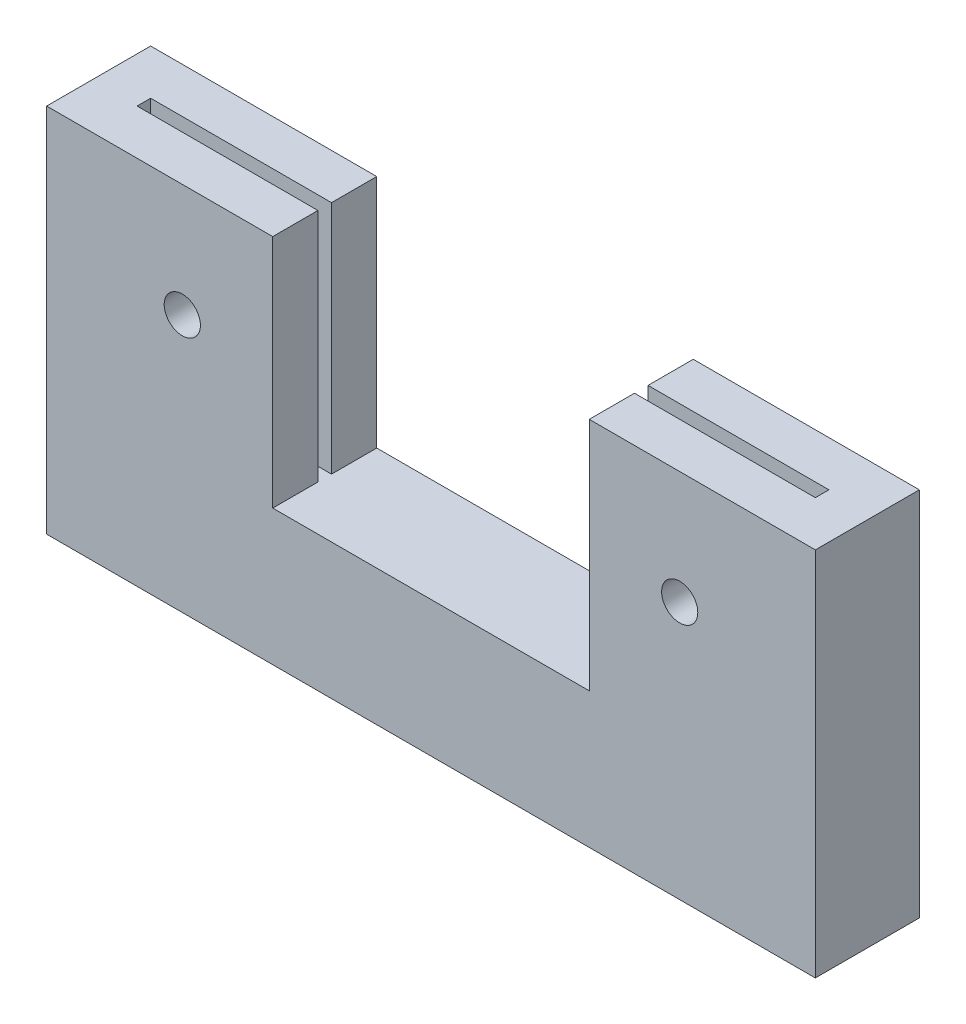
ISO-10303-21;
HEADER;
FILE_DESCRIPTION(('STEP AP214'),'2;1');
FILE_NAME('part.step','',(''),(''),'','','');
FILE_SCHEMA(('AUTOMOTIVE_DESIGN { 1 0 10303 214 1 1 1 1 }'));
ENDSEC;
DATA;
#1=APPLICATION_CONTEXT('core data for automotive mechanical design processes');
#2=APPLICATION_PROTOCOL_DEFINITION('international standard','automotive_design',2000,#1);
#3=PRODUCT_CONTEXT('',#1,'mechanical');
#4=PRODUCT('Part','Part','',(#3));
#5=PRODUCT_RELATED_PRODUCT_CATEGORY('part','',(#4));
#6=PRODUCT_DEFINITION_FORMATION('','',#4);
#7=PRODUCT_DEFINITION_CONTEXT('part definition',#1,'design');
#8=PRODUCT_DEFINITION('design','',#6,#7);
#9=PRODUCT_DEFINITION_SHAPE('','',#8);
#10=(LENGTH_UNIT() NAMED_UNIT(*) SI_UNIT(.MILLI.,.METRE.));
#11=(NAMED_UNIT(*) PLANE_ANGLE_UNIT() SI_UNIT($,.RADIAN.));
#12=(NAMED_UNIT(*) SI_UNIT($,.STERADIAN.) SOLID_ANGLE_UNIT());
#13=UNCERTAINTY_MEASURE_WITH_UNIT(LENGTH_MEASURE(1.E-05),#10,'distance_accuracy_value','');
#14=(GEOMETRIC_REPRESENTATION_CONTEXT(3) GLOBAL_UNCERTAINTY_ASSIGNED_CONTEXT((#13)) GLOBAL_UNIT_ASSIGNED_CONTEXT((#10,
#11,#12)) REPRESENTATION_CONTEXT('',''));
#15=CARTESIAN_POINT('',(0.,0.,0.));
#16=DIRECTION('',(0.,0.,1.));
#17=DIRECTION('',(1.,0.,0.));
#18=AXIS2_PLACEMENT_3D('',#15,#16,#17);
#19=CARTESIAN_POINT('',(0.,15.,0.));
#20=DIRECTION('',(0.,-1.,0.));
#21=DIRECTION('',(0.,0.,-1.));
#22=AXIS2_PLACEMENT_3D('',#19,#20,#21);
#23=PLANE('',#22);
#24=DIRECTION('',(0.,0.,1.));
#25=VECTOR('',#24,1.);
#26=CARTESIAN_POINT('',(17.5,15.,-5.75));
#27=LINE('',#26,#25);
#28=CARTESIAN_POINT('',(17.5,15.,-5.75));
#29=VERTEX_POINT('',#28);
#30=CARTESIAN_POINT('',(17.5,15.,-0.750000000000001));
#31=VERTEX_POINT('',#30);
#32=EDGE_CURVE('E295',#29,#31,#27,.T.);
#33=ORIENTED_EDGE('',*,*,#32,.F.);
#34=DIRECTION('',(-1.,0.,0.));
#35=VECTOR('',#34,1.);
#36=CARTESIAN_POINT('',(42.5,15.,-5.75));
#37=LINE('',#36,#35);
#38=CARTESIAN_POINT('',(-17.5,15.,-5.75));
#39=VERTEX_POINT('',#38);
#40=EDGE_CURVE('E37',#29,#39,#37,.T.);
#41=ORIENTED_EDGE('',*,*,#40,.T.);
#42=DIRECTION('',(0.,0.,-1.));
#43=VECTOR('',#42,1.);
#44=CARTESIAN_POINT('',(-17.5,15.,-5.75));
#45=LINE('',#44,#43);
#46=CARTESIAN_POINT('',(-17.5,15.,-0.750000000000001));
#47=VERTEX_POINT('',#46);
#48=EDGE_CURVE('E185',#47,#39,#45,.T.);
#49=ORIENTED_EDGE('',*,*,#48,.F.);
#50=DIRECTION('',(1.,0.,0.));
#51=VECTOR('',#50,1.);
#52=CARTESIAN_POINT('',(-17.5,15.,-0.750000000000001));
#53=LINE('',#52,#51);
#54=CARTESIAN_POINT('',(-37.5,15.,-0.749999999999998));
#55=VERTEX_POINT('',#54);
#56=EDGE_CURVE('E206',#55,#47,#53,.T.);
#57=ORIENTED_EDGE('',*,*,#56,.F.);
#58=DIRECTION('',(0.,0.,-1.));
#59=VECTOR('',#58,1.);
#60=CARTESIAN_POINT('',(-37.5,15.,-0.749999999999998));
#61=LINE('',#60,#59);
#62=CARTESIAN_POINT('',(-37.5,15.,0.75));
#63=VERTEX_POINT('',#62);
#64=EDGE_CURVE('E203',#63,#55,#61,.T.);
#65=ORIENTED_EDGE('',*,*,#64,.F.);
#66=DIRECTION('',(-1.,0.,0.));
#67=VECTOR('',#66,1.);
#68=CARTESIAN_POINT('',(-37.5,15.,0.75));
#69=LINE('',#68,#67);
#70=CARTESIAN_POINT('',(-17.5,15.,0.75));
#71=VERTEX_POINT('',#70);
#72=EDGE_CURVE('E175',#71,#63,#69,.T.);
#73=ORIENTED_EDGE('',*,*,#72,.F.);
#74=DIRECTION('',(0.,0.,-1.));
#75=VECTOR('',#74,1.);
#76=CARTESIAN_POINT('',(-17.5,15.,0.75));
#77=LINE('',#76,#75);
#78=CARTESIAN_POINT('',(-17.5,15.,5.75));
#79=VERTEX_POINT('',#78);
#80=EDGE_CURVE('E172',#79,#71,#77,.T.);
#81=ORIENTED_EDGE('',*,*,#80,.F.);
#82=DIRECTION('',(1.,0.,0.));
#83=VECTOR('',#82,1.);
#84=CARTESIAN_POINT('',(42.5,15.,5.75));
#85=LINE('',#84,#83);
#86=CARTESIAN_POINT('',(17.5,15.,5.75));
#87=VERTEX_POINT('',#86);
#88=EDGE_CURVE('E250',#79,#87,#85,.T.);
#89=ORIENTED_EDGE('',*,*,#88,.T.);
#90=DIRECTION('',(0.,0.,1.));
#91=VECTOR('',#90,1.);
#92=CARTESIAN_POINT('',(17.5,15.,5.75));
#93=LINE('',#92,#91);
#94=CARTESIAN_POINT('',(17.5,15.,0.750000000000003));
#95=VERTEX_POINT('',#94);
#96=EDGE_CURVE('E168',#95,#87,#93,.T.);
#97=ORIENTED_EDGE('',*,*,#96,.F.);
#98=DIRECTION('',(-1.,0.,0.));
#99=VECTOR('',#98,1.);
#100=CARTESIAN_POINT('',(17.5,15.,0.750000000000003));
#101=LINE('',#100,#99);
#102=CARTESIAN_POINT('',(37.5,15.,0.750000000000003));
#103=VERTEX_POINT('',#102);
#104=EDGE_CURVE('E277',#103,#95,#101,.T.);
#105=ORIENTED_EDGE('',*,*,#104,.F.);
#106=DIRECTION('',(0.,0.,1.));
#107=VECTOR('',#106,1.);
#108=CARTESIAN_POINT('',(37.5,15.,-0.750000000000003));
#109=LINE('',#108,#107);
#110=CARTESIAN_POINT('',(37.5,15.,-0.750000000000003));
#111=VERTEX_POINT('',#110);
#112=EDGE_CURVE('E56',#111,#103,#109,.T.);
#113=ORIENTED_EDGE('',*,*,#112,.F.);
#114=DIRECTION('',(1.,0.,0.));
#115=VECTOR('',#114,1.);
#116=CARTESIAN_POINT('',(37.5,15.,-0.750000000000003));
#117=LINE('',#116,#115);
#118=EDGE_CURVE('E51',#31,#111,#117,.T.);
#119=ORIENTED_EDGE('',*,*,#118,.F.);
#120=EDGE_LOOP('',(#33,#41,#49,#57,#65,#73,#81,#89,#97,#105,#113,#119));
#121=FACE_BOUND('',#120,.T.);
#122=ADVANCED_FACE('F33',(#121),#23,.F.);
#123=CARTESIAN_POINT('',(-42.5,15.,-5.75));
#124=DIRECTION('',(1.,0.,0.));
#125=DIRECTION('',(0.,0.,-1.));
#126=AXIS2_PLACEMENT_3D('',#123,#124,#125);
#127=PLANE('',#126);
#128=DIRECTION('',(0.,0.,1.));
#129=VECTOR('',#128,1.);
#130=CARTESIAN_POINT('',(-42.5,0.,-5.75));
#131=LINE('',#130,#129);
#132=CARTESIAN_POINT('',(-42.5,0.,-5.75));
#133=VERTEX_POINT('',#132);
#134=CARTESIAN_POINT('',(-42.5,0.,5.75));
#135=VERTEX_POINT('',#134);
#136=EDGE_CURVE('E242',#133,#135,#131,.T.);
#137=ORIENTED_EDGE('',*,*,#136,.T.);
#138=DIRECTION('',(0.,-1.,0.));
#139=VECTOR('',#138,1.);
#140=CARTESIAN_POINT('',(-42.5,15.,5.75));
#141=LINE('',#140,#139);
#142=CARTESIAN_POINT('',(-42.5,41.,5.75));
#143=VERTEX_POINT('',#142);
#144=EDGE_CURVE('E11',#143,#135,#141,.T.);
#145=ORIENTED_EDGE('',*,*,#144,.F.);
#146=DIRECTION('',(0.,0.,1.));
#147=VECTOR('',#146,1.);
#148=CARTESIAN_POINT('',(-42.5,41.,5.75));
#149=LINE('',#148,#147);
#150=CARTESIAN_POINT('',(-42.5,41.,-5.75));
#151=VERTEX_POINT('',#150);
#152=EDGE_CURVE('E181',#151,#143,#149,.T.);
#153=ORIENTED_EDGE('',*,*,#152,.F.);
#154=DIRECTION('',(0.,-1.,0.));
#155=VECTOR('',#154,1.);
#156=CARTESIAN_POINT('',(-42.5,15.,-5.75));
#157=LINE('',#156,#155);
#158=EDGE_CURVE('E373',#151,#133,#157,.T.);
#159=ORIENTED_EDGE('',*,*,#158,.T.);
#160=EDGE_LOOP('',(#137,#145,#153,#159));
#161=FACE_BOUND('',#160,.T.);
#162=ADVANCED_FACE('F35',(#161),#127,.F.);
#163=CARTESIAN_POINT('',(42.5,15.,5.75));
#164=DIRECTION('',(0.,0.,-1.));
#165=DIRECTION('',(-1.,0.,0.));
#166=AXIS2_PLACEMENT_3D('',#163,#164,#165);
#167=PLANE('',#166);
#168=CARTESIAN_POINT('',(27.5,28.5,5.75));
#169=DIRECTION('',(0.,0.,1.));
#170=DIRECTION('',(1.,0.,0.));
#171=AXIS2_PLACEMENT_3D('',#168,#169,#170);
#172=CIRCLE('',#171,2.);
#173=CARTESIAN_POINT('',(29.5,28.5,5.75));
#174=VERTEX_POINT('',#173);
#175=EDGE_CURVE('E315',#174,#174,#172,.T.);
#176=ORIENTED_EDGE('',*,*,#175,.F.);
#177=EDGE_LOOP('',(#176));
#178=FACE_BOUND('',#177,.T.);
#179=CARTESIAN_POINT('',(-27.5,28.5,5.75));
#180=DIRECTION('',(0.,0.,1.));
#181=DIRECTION('',(1.,0.,0.));
#182=AXIS2_PLACEMENT_3D('',#179,#180,#181);
#183=CIRCLE('',#182,2.);
#184=CARTESIAN_POINT('',(-25.5,28.5,5.75));
#185=VERTEX_POINT('',#184);
#186=EDGE_CURVE('E309',#185,#185,#183,.T.);
#187=ORIENTED_EDGE('',*,*,#186,.F.);
#188=EDGE_LOOP('',(#187));
#189=FACE_BOUND('',#188,.T.);
#190=DIRECTION('',(1.,0.,0.));
#191=VECTOR('',#190,1.);
#192=CARTESIAN_POINT('',(42.5,0.,5.75));
#193=LINE('',#192,#191);
#194=CARTESIAN_POINT('',(42.5,0.,5.75));
#195=VERTEX_POINT('',#194);
#196=EDGE_CURVE('E370',#135,#195,#193,.T.);
#197=ORIENTED_EDGE('',*,*,#196,.T.);
#198=DIRECTION('',(0.,-1.,0.));
#199=VECTOR('',#198,1.);
#200=CARTESIAN_POINT('',(42.5,15.,5.75));
#201=LINE('',#200,#199);
#202=CARTESIAN_POINT('',(42.5,41.,5.75));
#203=VERTEX_POINT('',#202);
#204=EDGE_CURVE('E43',#203,#195,#201,.T.);
#205=ORIENTED_EDGE('',*,*,#204,.F.);
#206=DIRECTION('',(1.,0.,0.));
#207=VECTOR('',#206,1.);
#208=CARTESIAN_POINT('',(42.5,41.,5.75));
#209=LINE('',#208,#207);
#210=CARTESIAN_POINT('',(17.5,41.,5.75));
#211=VERTEX_POINT('',#210);
#212=EDGE_CURVE('E301',#211,#203,#209,.T.);
#213=ORIENTED_EDGE('',*,*,#212,.F.);
#214=DIRECTION('',(0.,-1.,0.));
#215=VECTOR('',#214,1.);
#216=CARTESIAN_POINT('',(17.5,41.,5.75));
#217=LINE('',#216,#215);
#218=EDGE_CURVE('E268',#211,#87,#217,.T.);
#219=ORIENTED_EDGE('',*,*,#218,.T.);
#220=ORIENTED_EDGE('',*,*,#88,.F.);
#221=DIRECTION('',(0.,-1.,0.));
#222=VECTOR('',#221,1.);
#223=CARTESIAN_POINT('',(-17.5,41.,5.75));
#224=LINE('',#223,#222);
#225=CARTESIAN_POINT('',(-17.5,41.,5.75));
#226=VERTEX_POINT('',#225);
#227=EDGE_CURVE('E238',#226,#79,#224,.T.);
#228=ORIENTED_EDGE('',*,*,#227,.F.);
#229=DIRECTION('',(1.,0.,0.));
#230=VECTOR('',#229,1.);
#231=CARTESIAN_POINT('',(-17.5,41.,5.75));
#232=LINE('',#231,#230);
#233=EDGE_CURVE('E184',#143,#226,#232,.T.);
#234=ORIENTED_EDGE('',*,*,#233,.F.);
#235=ORIENTED_EDGE('',*,*,#144,.T.);
#236=EDGE_LOOP('',(#197,#205,#213,#219,#220,#228,#234,#235));
#237=FACE_BOUND('',#236,.T.);
#238=ADVANCED_FACE('F264',(#178,#189,#237),#167,.F.);
#239=CARTESIAN_POINT('',(42.5,15.,-5.75));
#240=DIRECTION('',(-1.,0.,0.));
#241=DIRECTION('',(0.,0.,1.));
#242=AXIS2_PLACEMENT_3D('',#239,#240,#241);
#243=PLANE('',#242);
#244=DIRECTION('',(0.,0.,-1.));
#245=VECTOR('',#244,1.);
#246=CARTESIAN_POINT('',(42.5,0.,-5.75));
#247=LINE('',#246,#245);
#248=CARTESIAN_POINT('',(42.5,0.,-5.75));
#249=VERTEX_POINT('',#248);
#250=EDGE_CURVE('E366',#195,#249,#247,.T.);
#251=ORIENTED_EDGE('',*,*,#250,.T.);
#252=DIRECTION('',(0.,-1.,0.));
#253=VECTOR('',#252,1.);
#254=CARTESIAN_POINT('',(42.5,15.,-5.75));
#255=LINE('',#254,#253);
#256=CARTESIAN_POINT('',(42.5,41.,-5.75));
#257=VERTEX_POINT('',#256);
#258=EDGE_CURVE('E367',#257,#249,#255,.T.);
#259=ORIENTED_EDGE('',*,*,#258,.F.);
#260=DIRECTION('',(0.,0.,-1.));
#261=VECTOR('',#260,1.);
#262=CARTESIAN_POINT('',(42.5,41.,-5.75));
#263=LINE('',#262,#261);
#264=EDGE_CURVE('E165',#203,#257,#263,.T.);
#265=ORIENTED_EDGE('',*,*,#264,.F.);
#266=ORIENTED_EDGE('',*,*,#204,.T.);
#267=EDGE_LOOP('',(#251,#259,#265,#266));
#268=FACE_BOUND('',#267,.T.);
#269=ADVANCED_FACE('F333',(#268),#243,.F.);
#270=CARTESIAN_POINT('',(42.5,15.,-5.75));
#271=DIRECTION('',(0.,0.,1.));
#272=DIRECTION('',(1.,0.,0.));
#273=AXIS2_PLACEMENT_3D('',#270,#271,#272);
#274=PLANE('',#273);
#275=DIRECTION('',(-1.,0.,0.));
#276=VECTOR('',#275,1.);
#277=CARTESIAN_POINT('',(42.5,0.,-5.75));
#278=LINE('',#277,#276);
#279=EDGE_CURVE('E251',#249,#133,#278,.T.);
#280=ORIENTED_EDGE('',*,*,#279,.T.);
#281=ORIENTED_EDGE('',*,*,#158,.F.);
#282=DIRECTION('',(-1.,0.,0.));
#283=VECTOR('',#282,1.);
#284=CARTESIAN_POINT('',(-42.5,41.,-5.75));
#285=LINE('',#284,#283);
#286=CARTESIAN_POINT('',(-17.5,41.,-5.75));
#287=VERTEX_POINT('',#286);
#288=EDGE_CURVE('E197',#287,#151,#285,.T.);
#289=ORIENTED_EDGE('',*,*,#288,.F.);
#290=DIRECTION('',(0.,-1.,0.));
#291=VECTOR('',#290,1.);
#292=CARTESIAN_POINT('',(-17.5,41.,-5.75));
#293=LINE('',#292,#291);
#294=EDGE_CURVE('E200',#287,#39,#293,.T.);
#295=ORIENTED_EDGE('',*,*,#294,.T.);
#296=ORIENTED_EDGE('',*,*,#40,.F.);
#297=DIRECTION('',(0.,-1.,0.));
#298=VECTOR('',#297,1.);
#299=CARTESIAN_POINT('',(17.5,41.,-5.75));
#300=LINE('',#299,#298);
#301=CARTESIAN_POINT('',(17.5,41.,-5.75));
#302=VERTEX_POINT('',#301);
#303=EDGE_CURVE('E152',#302,#29,#300,.T.);
#304=ORIENTED_EDGE('',*,*,#303,.F.);
#305=DIRECTION('',(-1.,0.,0.));
#306=VECTOR('',#305,1.);
#307=CARTESIAN_POINT('',(42.5,41.,-5.75));
#308=LINE('',#307,#306);
#309=EDGE_CURVE('E158',#257,#302,#308,.T.);
#310=ORIENTED_EDGE('',*,*,#309,.F.);
#311=ORIENTED_EDGE('',*,*,#258,.T.);
#312=EDGE_LOOP('',(#280,#281,#289,#295,#296,#304,#310,#311));
#313=FACE_BOUND('',#312,.T.);
#314=ADVANCED_FACE('F170',(#313),#274,.F.);
#315=CARTESIAN_POINT('',(0.,0.,0.));
#316=DIRECTION('',(0.,-1.,0.));
#317=DIRECTION('',(0.,0.,-1.));
#318=AXIS2_PLACEMENT_3D('',#315,#316,#317);
#319=PLANE('',#318);
#320=CARTESIAN_POINT('',(0.,0.,0.));
#321=DIRECTION('',(0.,-1.,0.));
#322=DIRECTION('',(0.,0.,-1.));
#323=AXIS2_PLACEMENT_3D('',#320,#321,#322);
#324=CIRCLE('',#323,2.75);
#325=CARTESIAN_POINT('',(0.,0.,-2.75));
#326=VERTEX_POINT('',#325);
#327=EDGE_CURVE('E243',#326,#326,#324,.T.);
#328=ORIENTED_EDGE('',*,*,#327,.F.);
#329=EDGE_LOOP('',(#328));
#330=FACE_BOUND('',#329,.T.);
#331=ORIENTED_EDGE('',*,*,#136,.F.);
#332=ORIENTED_EDGE('',*,*,#279,.F.);
#333=ORIENTED_EDGE('',*,*,#250,.F.);
#334=ORIENTED_EDGE('',*,*,#196,.F.);
#335=EDGE_LOOP('',(#331,#332,#333,#334));
#336=FACE_BOUND('',#335,.T.);
#337=ADVANCED_FACE('F354',(#330,#336),#319,.T.);
#338=CARTESIAN_POINT('',(0.,10.,0.));
#339=DIRECTION('',(0.,-1.,0.));
#340=DIRECTION('',(0.,0.,-1.));
#341=AXIS2_PLACEMENT_3D('',#338,#339,#340);
#342=CYLINDRICAL_SURFACE('',#341,2.75);
#343=CARTESIAN_POINT('',(0.,10.,0.));
#344=DIRECTION('',(0.,-1.,0.));
#345=DIRECTION('',(0.,0.,-1.));
#346=AXIS2_PLACEMENT_3D('',#343,#344,#345);
#347=CIRCLE('',#346,2.75);
#348=CARTESIAN_POINT('',(0.,10.,-2.75));
#349=VERTEX_POINT('',#348);
#350=EDGE_CURVE('E239',#349,#349,#347,.T.);
#351=ORIENTED_EDGE('',*,*,#350,.F.);
#352=EDGE_LOOP('',(#351));
#353=FACE_BOUND('',#352,.T.);
#354=ORIENTED_EDGE('',*,*,#327,.T.);
#355=EDGE_LOOP('',(#354));
#356=FACE_BOUND('',#355,.T.);
#357=ADVANCED_FACE('F352',(#353,#356),#342,.F.);
#358=CARTESIAN_POINT('',(0.,10.,0.));
#359=DIRECTION('',(0.,-1.,0.));
#360=DIRECTION('',(0.,0.,-1.));
#361=AXIS2_PLACEMENT_3D('',#358,#359,#360);
#362=PLANE('',#361);
#363=ORIENTED_EDGE('',*,*,#350,.T.);
#364=EDGE_LOOP('',(#363));
#365=FACE_BOUND('',#364,.T.);
#366=ADVANCED_FACE('F414',(#365),#362,.T.);
#367=CARTESIAN_POINT('',(-17.5,41.,0.75));
#368=DIRECTION('',(-1.,0.,0.));
#369=DIRECTION('',(0.,0.,1.));
#370=AXIS2_PLACEMENT_3D('',#367,#368,#369);
#371=PLANE('',#370);
#372=ORIENTED_EDGE('',*,*,#80,.T.);
#373=DIRECTION('',(0.,-1.,0.));
#374=VECTOR('',#373,1.);
#375=CARTESIAN_POINT('',(-17.5,41.,0.75));
#376=LINE('',#375,#374);
#377=CARTESIAN_POINT('',(-17.5,41.,0.75));
#378=VERTEX_POINT('',#377);
#379=EDGE_CURVE('E233',#378,#71,#376,.T.);
#380=ORIENTED_EDGE('',*,*,#379,.F.);
#381=DIRECTION('',(0.,0.,-1.));
#382=VECTOR('',#381,1.);
#383=CARTESIAN_POINT('',(-17.5,41.,0.75));
#384=LINE('',#383,#382);
#385=EDGE_CURVE('E187',#226,#378,#384,.T.);
#386=ORIENTED_EDGE('',*,*,#385,.F.);
#387=ORIENTED_EDGE('',*,*,#227,.T.);
#388=EDGE_LOOP('',(#372,#380,#386,#387));
#389=FACE_BOUND('',#388,.T.);
#390=ADVANCED_FACE('F259',(#389),#371,.F.);
#391=CARTESIAN_POINT('',(-37.5,41.,0.75));
#392=DIRECTION('',(0.,0.,1.));
#393=DIRECTION('',(1.,0.,0.));
#394=AXIS2_PLACEMENT_3D('',#391,#392,#393);
#395=PLANE('',#394);
#396=CARTESIAN_POINT('',(-27.5,28.5,0.749999999999998));
#397=DIRECTION('',(0.,0.,1.));
#398=DIRECTION('',(1.,0.,0.));
#399=AXIS2_PLACEMENT_3D('',#396,#397,#398);
#400=CIRCLE('',#399,2.);
#401=CARTESIAN_POINT('',(-25.5,28.5,0.749999999999998));
#402=VERTEX_POINT('',#401);
#403=EDGE_CURVE('E297',#402,#402,#400,.T.);
#404=ORIENTED_EDGE('',*,*,#403,.T.);
#405=EDGE_LOOP('',(#404));
#406=FACE_BOUND('',#405,.T.);
#407=ORIENTED_EDGE('',*,*,#72,.T.);
#408=DIRECTION('',(0.,-1.,0.));
#409=VECTOR('',#408,1.);
#410=CARTESIAN_POINT('',(-37.5,41.,0.75));
#411=LINE('',#410,#409);
#412=CARTESIAN_POINT('',(-37.5,41.,0.75));
#413=VERTEX_POINT('',#412);
#414=EDGE_CURVE('E228',#413,#63,#411,.T.);
#415=ORIENTED_EDGE('',*,*,#414,.F.);
#416=DIRECTION('',(-1.,0.,0.));
#417=VECTOR('',#416,1.);
#418=CARTESIAN_POINT('',(-37.5,41.,0.75));
#419=LINE('',#418,#417);
#420=EDGE_CURVE('E189',#378,#413,#419,.T.);
#421=ORIENTED_EDGE('',*,*,#420,.F.);
#422=ORIENTED_EDGE('',*,*,#379,.T.);
#423=EDGE_LOOP('',(#407,#415,#421,#422));
#424=FACE_BOUND('',#423,.T.);
#425=ADVANCED_FACE('F408',(#406,#424),#395,.F.);
#426=CARTESIAN_POINT('',(-37.5,41.,-0.749999999999998));
#427=DIRECTION('',(-1.,0.,0.));
#428=DIRECTION('',(0.,0.,1.));
#429=AXIS2_PLACEMENT_3D('',#426,#427,#428);
#430=PLANE('',#429);
#431=ORIENTED_EDGE('',*,*,#64,.T.);
#432=DIRECTION('',(0.,-1.,0.));
#433=VECTOR('',#432,1.);
#434=CARTESIAN_POINT('',(-37.5,41.,-0.749999999999998));
#435=LINE('',#434,#433);
#436=CARTESIAN_POINT('',(-37.5,41.,-0.749999999999998));
#437=VERTEX_POINT('',#436);
#438=EDGE_CURVE('E223',#437,#55,#435,.T.);
#439=ORIENTED_EDGE('',*,*,#438,.F.);
#440=DIRECTION('',(0.,0.,-1.));
#441=VECTOR('',#440,1.);
#442=CARTESIAN_POINT('',(-37.5,41.,-0.749999999999998));
#443=LINE('',#442,#441);
#444=EDGE_CURVE('E191',#413,#437,#443,.T.);
#445=ORIENTED_EDGE('',*,*,#444,.F.);
#446=ORIENTED_EDGE('',*,*,#414,.T.);
#447=EDGE_LOOP('',(#431,#439,#445,#446));
#448=FACE_BOUND('',#447,.T.);
#449=ADVANCED_FACE('F405',(#448),#430,.F.);
#450=CARTESIAN_POINT('',(-17.5,41.,-0.750000000000001));
#451=DIRECTION('',(0.,0.,-1.));
#452=DIRECTION('',(-1.,0.,0.));
#453=AXIS2_PLACEMENT_3D('',#450,#451,#452);
#454=PLANE('',#453);
#455=ORIENTED_EDGE('',*,*,#56,.T.);
#456=DIRECTION('',(0.,-1.,0.));
#457=VECTOR('',#456,1.);
#458=CARTESIAN_POINT('',(-17.5,41.,-0.750000000000001));
#459=LINE('',#458,#457);
#460=CARTESIAN_POINT('',(-17.5,41.,-0.750000000000001));
#461=VERTEX_POINT('',#460);
#462=EDGE_CURVE('E211',#461,#47,#459,.T.);
#463=ORIENTED_EDGE('',*,*,#462,.F.);
#464=DIRECTION('',(1.,0.,0.));
#465=VECTOR('',#464,1.);
#466=CARTESIAN_POINT('',(-17.5,41.,-0.750000000000001));
#467=LINE('',#466,#465);
#468=EDGE_CURVE('E193',#437,#461,#467,.T.);
#469=ORIENTED_EDGE('',*,*,#468,.F.);
#470=ORIENTED_EDGE('',*,*,#438,.T.);
#471=EDGE_LOOP('',(#455,#463,#469,#470));
#472=FACE_BOUND('',#471,.T.);
#473=ADVANCED_FACE('F402',(#472),#454,.F.);
#474=CARTESIAN_POINT('',(-17.5,41.,-5.75));
#475=DIRECTION('',(-1.,0.,0.));
#476=DIRECTION('',(0.,0.,1.));
#477=AXIS2_PLACEMENT_3D('',#474,#475,#476);
#478=PLANE('',#477);
#479=ORIENTED_EDGE('',*,*,#48,.T.);
#480=ORIENTED_EDGE('',*,*,#294,.F.);
#481=DIRECTION('',(0.,0.,-1.));
#482=VECTOR('',#481,1.);
#483=CARTESIAN_POINT('',(-17.5,41.,-5.75));
#484=LINE('',#483,#482);
#485=EDGE_CURVE('E195',#461,#287,#484,.T.);
#486=ORIENTED_EDGE('',*,*,#485,.F.);
#487=ORIENTED_EDGE('',*,*,#462,.T.);
#488=EDGE_LOOP('',(#479,#480,#486,#487));
#489=FACE_BOUND('',#488,.T.);
#490=ADVANCED_FACE('F381',(#489),#478,.F.);
#491=CARTESIAN_POINT('',(0.,41.,0.));
#492=DIRECTION('',(0.,-1.,0.));
#493=DIRECTION('',(0.,0.,-1.));
#494=AXIS2_PLACEMENT_3D('',#491,#492,#493);
#495=PLANE('',#494);
#496=ORIENTED_EDGE('',*,*,#152,.T.);
#497=ORIENTED_EDGE('',*,*,#233,.T.);
#498=ORIENTED_EDGE('',*,*,#385,.T.);
#499=ORIENTED_EDGE('',*,*,#420,.T.);
#500=ORIENTED_EDGE('',*,*,#444,.T.);
#501=ORIENTED_EDGE('',*,*,#468,.T.);
#502=ORIENTED_EDGE('',*,*,#485,.T.);
#503=ORIENTED_EDGE('',*,*,#288,.T.);
#504=EDGE_LOOP('',(#496,#497,#498,#499,#500,#501,#502,#503));
#505=FACE_BOUND('',#504,.T.);
#506=ADVANCED_FACE('F383',(#505),#495,.F.);
#507=CARTESIAN_POINT('',(17.5,41.,-5.75));
#508=DIRECTION('',(1.,0.,0.));
#509=DIRECTION('',(0.,0.,-1.));
#510=AXIS2_PLACEMENT_3D('',#507,#508,#509);
#511=PLANE('',#510);
#512=ORIENTED_EDGE('',*,*,#32,.T.);
#513=DIRECTION('',(0.,-1.,0.));
#514=VECTOR('',#513,1.);
#515=CARTESIAN_POINT('',(17.5,41.,-0.750000000000001));
#516=LINE('',#515,#514);
#517=CARTESIAN_POINT('',(17.5,41.,-0.750000000000001));
#518=VERTEX_POINT('',#517);
#519=EDGE_CURVE('E154',#518,#31,#516,.T.);
#520=ORIENTED_EDGE('',*,*,#519,.F.);
#521=DIRECTION('',(0.,0.,1.));
#522=VECTOR('',#521,1.);
#523=CARTESIAN_POINT('',(17.5,41.,-5.75));
#524=LINE('',#523,#522);
#525=EDGE_CURVE('E148',#302,#518,#524,.T.);
#526=ORIENTED_EDGE('',*,*,#525,.F.);
#527=ORIENTED_EDGE('',*,*,#303,.T.);
#528=EDGE_LOOP('',(#512,#520,#526,#527));
#529=FACE_BOUND('',#528,.T.);
#530=ADVANCED_FACE('F150',(#529),#511,.F.);
#531=CARTESIAN_POINT('',(37.5,41.,-0.750000000000003));
#532=DIRECTION('',(0.,0.,-1.));
#533=DIRECTION('',(-1.,0.,0.));
#534=AXIS2_PLACEMENT_3D('',#531,#532,#533);
#535=PLANE('',#534);
#536=ORIENTED_EDGE('',*,*,#118,.T.);
#537=DIRECTION('',(0.,-1.,0.));
#538=VECTOR('',#537,1.);
#539=CARTESIAN_POINT('',(37.5,41.,-0.750000000000003));
#540=LINE('',#539,#538);
#541=CARTESIAN_POINT('',(37.5,41.,-0.750000000000003));
#542=VERTEX_POINT('',#541);
#543=EDGE_CURVE('E177',#542,#111,#540,.T.);
#544=ORIENTED_EDGE('',*,*,#543,.F.);
#545=DIRECTION('',(1.,0.,0.));
#546=VECTOR('',#545,1.);
#547=CARTESIAN_POINT('',(37.5,41.,-0.750000000000003));
#548=LINE('',#547,#546);
#549=EDGE_CURVE('E157',#518,#542,#548,.T.);
#550=ORIENTED_EDGE('',*,*,#549,.F.);
#551=ORIENTED_EDGE('',*,*,#519,.T.);
#552=EDGE_LOOP('',(#536,#544,#550,#551));
#553=FACE_BOUND('',#552,.T.);
#554=ADVANCED_FACE('F294',(#553),#535,.F.);
#555=CARTESIAN_POINT('',(37.5,41.,-0.750000000000003));
#556=DIRECTION('',(1.,0.,0.));
#557=DIRECTION('',(0.,0.,-1.));
#558=AXIS2_PLACEMENT_3D('',#555,#556,#557);
#559=PLANE('',#558);
#560=ORIENTED_EDGE('',*,*,#112,.T.);
#561=DIRECTION('',(0.,-1.,0.));
#562=VECTOR('',#561,1.);
#563=CARTESIAN_POINT('',(37.5,41.,0.750000000000003));
#564=LINE('',#563,#562);
#565=CARTESIAN_POINT('',(37.5,41.,0.750000000000003));
#566=VERTEX_POINT('',#565);
#567=EDGE_CURVE('E284',#566,#103,#564,.T.);
#568=ORIENTED_EDGE('',*,*,#567,.F.);
#569=DIRECTION('',(0.,0.,1.));
#570=VECTOR('',#569,1.);
#571=CARTESIAN_POINT('',(37.5,41.,-0.750000000000003));
#572=LINE('',#571,#570);
#573=EDGE_CURVE('E292',#542,#566,#572,.T.);
#574=ORIENTED_EDGE('',*,*,#573,.F.);
#575=ORIENTED_EDGE('',*,*,#543,.T.);
#576=EDGE_LOOP('',(#560,#568,#574,#575));
#577=FACE_BOUND('',#576,.T.);
#578=ADVANCED_FACE('F290',(#577),#559,.F.);
#579=CARTESIAN_POINT('',(17.5,41.,0.750000000000003));
#580=DIRECTION('',(0.,0.,1.));
#581=DIRECTION('',(1.,0.,0.));
#582=AXIS2_PLACEMENT_3D('',#579,#580,#581);
#583=PLANE('',#582);
#584=CARTESIAN_POINT('',(27.5,28.5,0.749999999999998));
#585=DIRECTION('',(0.,0.,1.));
#586=DIRECTION('',(1.,0.,0.));
#587=AXIS2_PLACEMENT_3D('',#584,#585,#586);
#588=CIRCLE('',#587,2.);
#589=CARTESIAN_POINT('',(29.5,28.5,0.749999999999998));
#590=VERTEX_POINT('',#589);
#591=EDGE_CURVE('E312',#590,#590,#588,.T.);
#592=ORIENTED_EDGE('',*,*,#591,.T.);
#593=EDGE_LOOP('',(#592));
#594=FACE_BOUND('',#593,.T.);
#595=ORIENTED_EDGE('',*,*,#104,.T.);
#596=DIRECTION('',(0.,-1.,0.));
#597=VECTOR('',#596,1.);
#598=CARTESIAN_POINT('',(17.5,41.,0.750000000000003));
#599=LINE('',#598,#597);
#600=CARTESIAN_POINT('',(17.5,41.,0.750000000000003));
#601=VERTEX_POINT('',#600);
#602=EDGE_CURVE('E276',#601,#95,#599,.T.);
#603=ORIENTED_EDGE('',*,*,#602,.F.);
#604=DIRECTION('',(-1.,0.,0.));
#605=VECTOR('',#604,1.);
#606=CARTESIAN_POINT('',(17.5,41.,0.750000000000003));
#607=LINE('',#606,#605);
#608=EDGE_CURVE('E305',#566,#601,#607,.T.);
#609=ORIENTED_EDGE('',*,*,#608,.F.);
#610=ORIENTED_EDGE('',*,*,#567,.T.);
#611=EDGE_LOOP('',(#595,#603,#609,#610));
#612=FACE_BOUND('',#611,.T.);
#613=ADVANCED_FACE('F321',(#594,#612),#583,.F.);
#614=CARTESIAN_POINT('',(17.5,41.,5.75));
#615=DIRECTION('',(1.,0.,0.));
#616=DIRECTION('',(0.,0.,-1.));
#617=AXIS2_PLACEMENT_3D('',#614,#615,#616);
#618=PLANE('',#617);
#619=ORIENTED_EDGE('',*,*,#96,.T.);
#620=ORIENTED_EDGE('',*,*,#218,.F.);
#621=DIRECTION('',(0.,0.,1.));
#622=VECTOR('',#621,1.);
#623=CARTESIAN_POINT('',(17.5,41.,5.75));
#624=LINE('',#623,#622);
#625=EDGE_CURVE('E303',#601,#211,#624,.T.);
#626=ORIENTED_EDGE('',*,*,#625,.F.);
#627=ORIENTED_EDGE('',*,*,#602,.T.);
#628=EDGE_LOOP('',(#619,#620,#626,#627));
#629=FACE_BOUND('',#628,.T.);
#630=ADVANCED_FACE('F273',(#629),#618,.F.);
#631=CARTESIAN_POINT('',(0.,41.,0.));
#632=DIRECTION('',(0.,1.,0.));
#633=DIRECTION('',(0.,0.,1.));
#634=AXIS2_PLACEMENT_3D('',#631,#632,#633);
#635=PLANE('',#634);
#636=ORIENTED_EDGE('',*,*,#309,.T.);
#637=ORIENTED_EDGE('',*,*,#525,.T.);
#638=ORIENTED_EDGE('',*,*,#549,.T.);
#639=ORIENTED_EDGE('',*,*,#573,.T.);
#640=ORIENTED_EDGE('',*,*,#608,.T.);
#641=ORIENTED_EDGE('',*,*,#625,.T.);
#642=ORIENTED_EDGE('',*,*,#212,.T.);
#643=ORIENTED_EDGE('',*,*,#264,.T.);
#644=EDGE_LOOP('',(#636,#637,#638,#639,#640,#641,#642,#643));
#645=FACE_BOUND('',#644,.T.);
#646=ADVANCED_FACE('F162',(#645),#635,.T.);
#647=CARTESIAN_POINT('',(-27.5,28.5,0.749999999999998));
#648=DIRECTION('',(0.,0.,1.));
#649=DIRECTION('',(1.,0.,0.));
#650=AXIS2_PLACEMENT_3D('',#647,#648,#649);
#651=CYLINDRICAL_SURFACE('',#650,2.);
#652=ORIENTED_EDGE('',*,*,#403,.F.);
#653=EDGE_LOOP('',(#652));
#654=FACE_BOUND('',#653,.T.);
#655=ORIENTED_EDGE('',*,*,#186,.T.);
#656=EDGE_LOOP('',(#655));
#657=FACE_BOUND('',#656,.T.);
#658=ADVANCED_FACE('F327',(#654,#657),#651,.F.);
#659=CARTESIAN_POINT('',(27.5,28.5,0.749999999999998));
#660=DIRECTION('',(0.,0.,1.));
#661=DIRECTION('',(1.,0.,0.));
#662=AXIS2_PLACEMENT_3D('',#659,#660,#661);
#663=CYLINDRICAL_SURFACE('',#662,2.);
#664=ORIENTED_EDGE('',*,*,#591,.F.);
#665=EDGE_LOOP('',(#664));
#666=FACE_BOUND('',#665,.T.);
#667=ORIENTED_EDGE('',*,*,#175,.T.);
#668=EDGE_LOOP('',(#667));
#669=FACE_BOUND('',#668,.T.);
#670=ADVANCED_FACE('F324',(#666,#669),#663,.F.);
#671=CLOSED_SHELL('',(#122,#162,#238,#269,#314,#337,#357,#366,#390,#425,#449,#473,#490,#506,
#530,#554,#578,#613,#630,#646,#658,#670));
#672=MANIFOLD_SOLID_BREP('B2',#671);
#673=ADVANCED_BREP_SHAPE_REPRESENTATION('',(#18,#672),#14);
#674=SHAPE_DEFINITION_REPRESENTATION(#9,#673);
ENDSEC;
END-ISO-10303-21;
